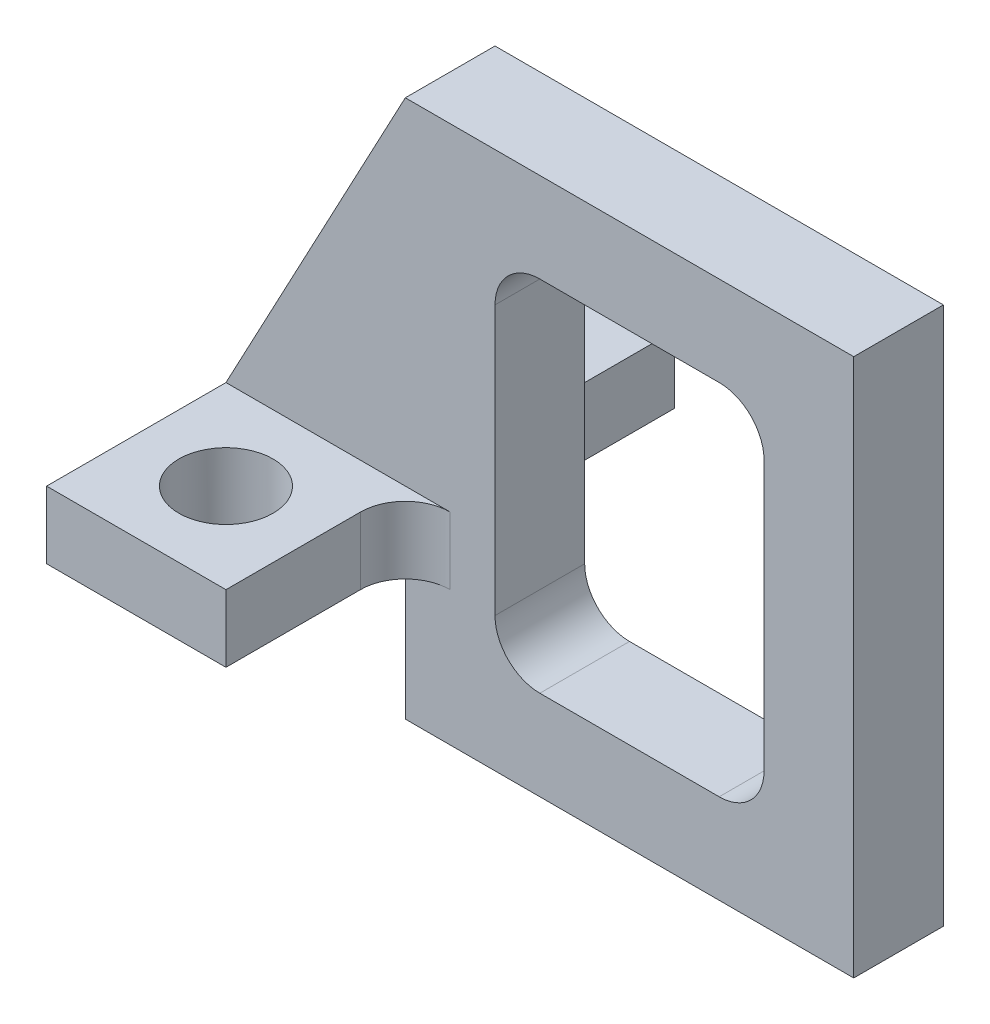
ISO-10303-21;
HEADER;
FILE_DESCRIPTION(('STEP AP214'),'2;1');
FILE_NAME('part.step','',(''),(''),'','','');
FILE_SCHEMA(('AUTOMOTIVE_DESIGN { 1 0 10303 214 1 1 1 1 }'));
ENDSEC;
DATA;
#1=APPLICATION_CONTEXT('core data for automotive mechanical design processes');
#2=APPLICATION_PROTOCOL_DEFINITION('international standard','automotive_design',2000,#1);
#3=PRODUCT_CONTEXT('',#1,'mechanical');
#4=PRODUCT('Part','Part','',(#3));
#5=PRODUCT_RELATED_PRODUCT_CATEGORY('part','',(#4));
#6=PRODUCT_DEFINITION_FORMATION('','',#4);
#7=PRODUCT_DEFINITION_CONTEXT('part definition',#1,'design');
#8=PRODUCT_DEFINITION('design','',#6,#7);
#9=PRODUCT_DEFINITION_SHAPE('','',#8);
#10=(LENGTH_UNIT() NAMED_UNIT(*) SI_UNIT(.MILLI.,.METRE.));
#11=(NAMED_UNIT(*) PLANE_ANGLE_UNIT() SI_UNIT($,.RADIAN.));
#12=(NAMED_UNIT(*) SI_UNIT($,.STERADIAN.) SOLID_ANGLE_UNIT());
#13=UNCERTAINTY_MEASURE_WITH_UNIT(LENGTH_MEASURE(1.E-05),#10,'distance_accuracy_value','');
#14=(GEOMETRIC_REPRESENTATION_CONTEXT(3) GLOBAL_UNCERTAINTY_ASSIGNED_CONTEXT((#13)) GLOBAL_UNIT_ASSIGNED_CONTEXT((#10,
#11,#12)) REPRESENTATION_CONTEXT('',''));
#15=CARTESIAN_POINT('',(0.,0.,0.));
#16=DIRECTION('',(0.,0.,1.));
#17=DIRECTION('',(1.,0.,0.));
#18=AXIS2_PLACEMENT_3D('',#15,#16,#17);
#19=CARTESIAN_POINT('',(-12.,5.,-8.));
#20=DIRECTION('',(0.,-1.,0.));
#21=DIRECTION('',(0.,0.,-1.));
#22=AXIS2_PLACEMENT_3D('',#19,#20,#21);
#23=PLANE('',#22);
#24=CARTESIAN_POINT('',(-8.,5.,-4.));
#25=DIRECTION('',(0.,1.,0.));
#26=DIRECTION('',(0.,0.,1.));
#27=AXIS2_PLACEMENT_3D('',#24,#25,#26);
#28=CIRCLE('',#27,2.1);
#29=CARTESIAN_POINT('',(-8.,5.,-1.9));
#30=VERTEX_POINT('',#29);
#31=EDGE_CURVE('E234',#30,#30,#28,.T.);
#32=ORIENTED_EDGE('',*,*,#31,.F.);
#33=EDGE_LOOP('',(#32));
#34=FACE_BOUND('',#33,.T.);
#35=DIRECTION('',(1.,0.,0.));
#36=VECTOR('',#35,1.);
#37=CARTESIAN_POINT('',(-4.,5.,0.));
#38=LINE('',#37,#36);
#39=CARTESIAN_POINT('',(-12.,5.,0.));
#40=VERTEX_POINT('',#39);
#41=CARTESIAN_POINT('',(-2.,5.,0.));
#42=VERTEX_POINT('',#41);
#43=EDGE_CURVE('E206',#40,#42,#38,.T.);
#44=ORIENTED_EDGE('',*,*,#43,.T.);
#45=CARTESIAN_POINT('',(-2.,5.,-2.));
#46=DIRECTION('',(0.,-1.,0.));
#47=DIRECTION('',(0.,0.,-1.));
#48=AXIS2_PLACEMENT_3D('',#45,#46,#47);
#49=CIRCLE('',#48,2.);
#50=CARTESIAN_POINT('',(-4.,5.,-2.));
#51=VERTEX_POINT('',#50);
#52=EDGE_CURVE('E11',#42,#51,#49,.T.);
#53=ORIENTED_EDGE('',*,*,#52,.T.);
#54=DIRECTION('',(0.,0.,-1.));
#55=VECTOR('',#54,1.);
#56=CARTESIAN_POINT('',(-4.,5.,-8.));
#57=LINE('',#56,#55);
#58=CARTESIAN_POINT('',(-4.,5.,-8.));
#59=VERTEX_POINT('',#58);
#60=EDGE_CURVE('E328',#51,#59,#57,.T.);
#61=ORIENTED_EDGE('',*,*,#60,.T.);
#62=DIRECTION('',(1.,0.,0.));
#63=VECTOR('',#62,1.);
#64=CARTESIAN_POINT('',(-12.,5.,-8.));
#65=LINE('',#64,#63);
#66=CARTESIAN_POINT('',(-12.,5.,-8.));
#67=VERTEX_POINT('',#66);
#68=EDGE_CURVE('E339',#67,#59,#65,.T.);
#69=ORIENTED_EDGE('',*,*,#68,.F.);
#70=DIRECTION('',(0.,0.,-1.));
#71=VECTOR('',#70,1.);
#72=CARTESIAN_POINT('',(-12.,5.,-8.));
#73=LINE('',#72,#71);
#74=EDGE_CURVE('E317',#40,#67,#73,.T.);
#75=ORIENTED_EDGE('',*,*,#74,.F.);
#76=EDGE_LOOP('',(#44,#53,#61,#69,#75));
#77=FACE_BOUND('',#76,.T.);
#78=ADVANCED_FACE('F41',(#34,#77),#23,.F.);
#79=CARTESIAN_POINT('',(-4.,-4.,4.));
#80=DIRECTION('',(1.,0.,0.));
#81=DIRECTION('',(0.,0.,-1.));
#82=AXIS2_PLACEMENT_3D('',#79,#80,#81);
#83=PLANE('',#82);
#84=DIRECTION('',(0.,0.,1.));
#85=VECTOR('',#84,1.);
#86=CARTESIAN_POINT('',(-4.,2.,-8.));
#87=LINE('',#86,#85);
#88=CARTESIAN_POINT('',(-4.,2.,0.));
#89=VERTEX_POINT('',#88);
#90=CARTESIAN_POINT('',(-4.,2.,4.));
#91=VERTEX_POINT('',#90);
#92=EDGE_CURVE('E229',#89,#91,#87,.T.);
#93=ORIENTED_EDGE('',*,*,#92,.F.);
#94=DIRECTION('',(0.,-1.,0.));
#95=VECTOR('',#94,1.);
#96=CARTESIAN_POINT('',(-4.,-4.,0.));
#97=LINE('',#96,#95);
#98=CARTESIAN_POINT('',(-4.,-4.,0.));
#99=VERTEX_POINT('',#98);
#100=EDGE_CURVE('E213',#89,#99,#97,.T.);
#101=ORIENTED_EDGE('',*,*,#100,.T.);
#102=DIRECTION('',(0.,0.,-1.));
#103=VECTOR('',#102,1.);
#104=CARTESIAN_POINT('',(-4.,-4.,4.));
#105=LINE('',#104,#103);
#106=CARTESIAN_POINT('',(-4.,-4.,4.));
#107=VERTEX_POINT('',#106);
#108=EDGE_CURVE('E198',#107,#99,#105,.T.);
#109=ORIENTED_EDGE('',*,*,#108,.F.);
#110=DIRECTION('',(0.,-1.,0.));
#111=VECTOR('',#110,1.);
#112=CARTESIAN_POINT('',(-4.,-4.,4.));
#113=LINE('',#112,#111);
#114=EDGE_CURVE('E223',#91,#107,#113,.T.);
#115=ORIENTED_EDGE('',*,*,#114,.F.);
#116=EDGE_LOOP('',(#93,#101,#109,#115));
#117=FACE_BOUND('',#116,.T.);
#118=ADVANCED_FACE('F385',(#117),#83,.F.);
#119=CARTESIAN_POINT('',(0.,0.,4.));
#120=DIRECTION('',(0.,0.,1.));
#121=DIRECTION('',(1.,0.,0.));
#122=AXIS2_PLACEMENT_3D('',#119,#120,#121);
#123=PLANE('',#122);
#124=DIRECTION('',(0.,-1.,0.));
#125=VECTOR('',#124,1.);
#126=CARTESIAN_POINT('',(-2.,2.,4.));
#127=LINE('',#126,#125);
#128=CARTESIAN_POINT('',(-2.,5.,4.));
#129=VERTEX_POINT('',#128);
#130=CARTESIAN_POINT('',(-2.,2.,4.));
#131=VERTEX_POINT('',#130);
#132=EDGE_CURVE('E274',#129,#131,#127,.T.);
#133=ORIENTED_EDGE('',*,*,#132,.T.);
#134=DIRECTION('',(-1.,0.,0.));
#135=VECTOR('',#134,1.);
#136=CARTESIAN_POINT('',(0.,2.,4.));
#137=LINE('',#136,#135);
#138=EDGE_CURVE('E277',#131,#91,#137,.T.);
#139=ORIENTED_EDGE('',*,*,#138,.T.);
#140=ORIENTED_EDGE('',*,*,#114,.T.);
#141=DIRECTION('',(1.,0.,0.));
#142=VECTOR('',#141,1.);
#143=CARTESIAN_POINT('',(-4.,-4.,4.));
#144=LINE('',#143,#142);
#145=CARTESIAN_POINT('',(16.,-4.,4.));
#146=VERTEX_POINT('',#145);
#147=EDGE_CURVE('E216',#107,#146,#144,.T.);
#148=ORIENTED_EDGE('',*,*,#147,.T.);
#149=DIRECTION('',(0.,1.,0.));
#150=VECTOR('',#149,1.);
#151=CARTESIAN_POINT('',(16.,-4.,4.));
#152=LINE('',#151,#150);
#153=CARTESIAN_POINT('',(16.,20.,4.));
#154=VERTEX_POINT('',#153);
#155=EDGE_CURVE('E370',#146,#154,#152,.T.);
#156=ORIENTED_EDGE('',*,*,#155,.T.);
#157=DIRECTION('',(-1.,0.,0.));
#158=VECTOR('',#157,1.);
#159=CARTESIAN_POINT('',(-4.,20.,4.));
#160=LINE('',#159,#158);
#161=CARTESIAN_POINT('',(-4.,20.,4.));
#162=VERTEX_POINT('',#161);
#163=EDGE_CURVE('E372',#154,#162,#160,.T.);
#164=ORIENTED_EDGE('',*,*,#163,.T.);
#165=DIRECTION('',(-0.470588235294118,-0.882352941176471,0.));
#166=VECTOR('',#165,1.);
#167=CARTESIAN_POINT('',(-12.,5.,4.));
#168=LINE('',#167,#166);
#169=CARTESIAN_POINT('',(-12.,5.,4.));
#170=VERTEX_POINT('',#169);
#171=EDGE_CURVE('E192',#162,#170,#168,.T.);
#172=ORIENTED_EDGE('',*,*,#171,.T.);
#173=DIRECTION('',(1.,0.,0.));
#174=VECTOR('',#173,1.);
#175=CARTESIAN_POINT('',(-4.,5.,4.));
#176=LINE('',#175,#174);
#177=EDGE_CURVE('E237',#170,#129,#176,.T.);
#178=ORIENTED_EDGE('',*,*,#177,.T.);
#179=EDGE_LOOP('',(#133,#139,#140,#148,#156,#164,#172,#178));
#180=FACE_BOUND('',#179,.T.);
#181=DIRECTION('',(1.,0.,0.));
#182=VECTOR('',#181,1.);
#183=CARTESIAN_POINT('',(0.,0.,4.));
#184=LINE('',#183,#182);
#185=CARTESIAN_POINT('',(2.,0.,4.));
#186=VERTEX_POINT('',#185);
#187=CARTESIAN_POINT('',(10.,0.,4.));
#188=VERTEX_POINT('',#187);
#189=EDGE_CURVE('E348',#186,#188,#184,.T.);
#190=ORIENTED_EDGE('',*,*,#189,.F.);
#191=CARTESIAN_POINT('',(2.,2.,4.));
#192=DIRECTION('',(0.,0.,1.));
#193=DIRECTION('',(1.,0.,0.));
#194=AXIS2_PLACEMENT_3D('',#191,#192,#193);
#195=CIRCLE('',#194,2.);
#196=CARTESIAN_POINT('',(0.,2.,4.));
#197=VERTEX_POINT('',#196);
#198=EDGE_CURVE('E272',#186,#197,#195,.F.);
#199=ORIENTED_EDGE('',*,*,#198,.T.);
#200=DIRECTION('',(0.,-1.,0.));
#201=VECTOR('',#200,1.);
#202=CARTESIAN_POINT('',(0.,0.,4.));
#203=LINE('',#202,#201);
#204=CARTESIAN_POINT('',(0.,14.,4.));
#205=VERTEX_POINT('',#204);
#206=EDGE_CURVE('E345',#205,#197,#203,.T.);
#207=ORIENTED_EDGE('',*,*,#206,.F.);
#208=CARTESIAN_POINT('',(2.,14.,4.));
#209=DIRECTION('',(0.,0.,1.));
#210=DIRECTION('',(1.,0.,0.));
#211=AXIS2_PLACEMENT_3D('',#208,#209,#210);
#212=CIRCLE('',#211,2.);
#213=CARTESIAN_POINT('',(2.,16.,4.));
#214=VERTEX_POINT('',#213);
#215=EDGE_CURVE('E260',#205,#214,#212,.F.);
#216=ORIENTED_EDGE('',*,*,#215,.T.);
#217=DIRECTION('',(-1.,0.,0.));
#218=VECTOR('',#217,1.);
#219=CARTESIAN_POINT('',(0.,16.,4.));
#220=LINE('',#219,#218);
#221=CARTESIAN_POINT('',(10.,16.,4.));
#222=VERTEX_POINT('',#221);
#223=EDGE_CURVE('E355',#222,#214,#220,.T.);
#224=ORIENTED_EDGE('',*,*,#223,.F.);
#225=CARTESIAN_POINT('',(10.,14.,4.));
#226=DIRECTION('',(0.,0.,1.));
#227=DIRECTION('',(1.,0.,0.));
#228=AXIS2_PLACEMENT_3D('',#225,#226,#227);
#229=CIRCLE('',#228,2.);
#230=CARTESIAN_POINT('',(12.,14.,4.));
#231=VERTEX_POINT('',#230);
#232=EDGE_CURVE('E264',#222,#231,#229,.F.);
#233=ORIENTED_EDGE('',*,*,#232,.T.);
#234=DIRECTION('',(0.,1.,0.));
#235=VECTOR('',#234,1.);
#236=CARTESIAN_POINT('',(12.,0.,4.));
#237=LINE('',#236,#235);
#238=CARTESIAN_POINT('',(12.,2.,4.));
#239=VERTEX_POINT('',#238);
#240=EDGE_CURVE('E352',#239,#231,#237,.T.);
#241=ORIENTED_EDGE('',*,*,#240,.F.);
#242=CARTESIAN_POINT('',(10.,2.,4.));
#243=DIRECTION('',(0.,0.,1.));
#244=DIRECTION('',(1.,0.,0.));
#245=AXIS2_PLACEMENT_3D('',#242,#243,#244);
#246=CIRCLE('',#245,2.);
#247=EDGE_CURVE('E268',#239,#188,#246,.F.);
#248=ORIENTED_EDGE('',*,*,#247,.T.);
#249=EDGE_LOOP('',(#190,#199,#207,#216,#224,#233,#241,#248));
#250=FACE_BOUND('',#249,.T.);
#251=ADVANCED_FACE('F305',(#180,#250),#123,.T.);
#252=CARTESIAN_POINT('',(0.,0.,0.));
#253=DIRECTION('',(0.,0.,1.));
#254=DIRECTION('',(1.,0.,0.));
#255=AXIS2_PLACEMENT_3D('',#252,#253,#254);
#256=PLANE('',#255);
#257=ORIENTED_EDGE('',*,*,#100,.F.);
#258=DIRECTION('',(1.,0.,0.));
#259=VECTOR('',#258,1.);
#260=CARTESIAN_POINT('',(-12.,2.,0.));
#261=LINE('',#260,#259);
#262=CARTESIAN_POINT('',(-2.,2.,0.));
#263=VERTEX_POINT('',#262);
#264=EDGE_CURVE('E56',#89,#263,#261,.T.);
#265=ORIENTED_EDGE('',*,*,#264,.T.);
#266=DIRECTION('',(0.,-1.,0.));
#267=VECTOR('',#266,1.);
#268=CARTESIAN_POINT('',(-2.,0.,0.));
#269=LINE('',#268,#267);
#270=EDGE_CURVE('E284',#263,#42,#269,.F.);
#271=ORIENTED_EDGE('',*,*,#270,.T.);
#272=ORIENTED_EDGE('',*,*,#43,.F.);
#273=DIRECTION('',(-0.470588235294118,-0.882352941176471,0.));
#274=VECTOR('',#273,1.);
#275=CARTESIAN_POINT('',(-12.,5.,0.));
#276=LINE('',#275,#274);
#277=CARTESIAN_POINT('',(-4.,20.,0.));
#278=VERTEX_POINT('',#277);
#279=EDGE_CURVE('E189',#278,#40,#276,.T.);
#280=ORIENTED_EDGE('',*,*,#279,.F.);
#281=DIRECTION('',(-1.,0.,0.));
#282=VECTOR('',#281,1.);
#283=CARTESIAN_POINT('',(-4.,20.,0.));
#284=LINE('',#283,#282);
#285=CARTESIAN_POINT('',(16.,20.,0.));
#286=VERTEX_POINT('',#285);
#287=EDGE_CURVE('E204',#286,#278,#284,.T.);
#288=ORIENTED_EDGE('',*,*,#287,.F.);
#289=DIRECTION('',(0.,1.,0.));
#290=VECTOR('',#289,1.);
#291=CARTESIAN_POINT('',(16.,-4.,0.));
#292=LINE('',#291,#290);
#293=CARTESIAN_POINT('',(16.,-4.,0.));
#294=VERTEX_POINT('',#293);
#295=EDGE_CURVE('E214',#294,#286,#292,.T.);
#296=ORIENTED_EDGE('',*,*,#295,.F.);
#297=DIRECTION('',(1.,0.,0.));
#298=VECTOR('',#297,1.);
#299=CARTESIAN_POINT('',(-4.,-4.,0.));
#300=LINE('',#299,#298);
#301=EDGE_CURVE('E218',#99,#294,#300,.T.);
#302=ORIENTED_EDGE('',*,*,#301,.F.);
#303=EDGE_LOOP('',(#257,#265,#271,#272,#280,#288,#296,#302));
#304=FACE_BOUND('',#303,.T.);
#305=DIRECTION('',(-1.,0.,0.));
#306=VECTOR('',#305,1.);
#307=CARTESIAN_POINT('',(0.,16.,0.));
#308=LINE('',#307,#306);
#309=CARTESIAN_POINT('',(10.,16.,0.));
#310=VERTEX_POINT('',#309);
#311=CARTESIAN_POINT('',(2.,16.,0.));
#312=VERTEX_POINT('',#311);
#313=EDGE_CURVE('E349',#310,#312,#308,.T.);
#314=ORIENTED_EDGE('',*,*,#313,.T.);
#315=CARTESIAN_POINT('',(2.,14.,0.));
#316=DIRECTION('',(0.,0.,1.));
#317=DIRECTION('',(1.,0.,0.));
#318=AXIS2_PLACEMENT_3D('',#315,#316,#317);
#319=CIRCLE('',#318,2.);
#320=CARTESIAN_POINT('',(0.,14.,0.));
#321=VERTEX_POINT('',#320);
#322=EDGE_CURVE('E258',#312,#321,#319,.T.);
#323=ORIENTED_EDGE('',*,*,#322,.T.);
#324=DIRECTION('',(0.,-1.,0.));
#325=VECTOR('',#324,1.);
#326=CARTESIAN_POINT('',(0.,0.,0.));
#327=LINE('',#326,#325);
#328=CARTESIAN_POINT('',(0.,2.,0.));
#329=VERTEX_POINT('',#328);
#330=EDGE_CURVE('E344',#321,#329,#327,.T.);
#331=ORIENTED_EDGE('',*,*,#330,.T.);
#332=CARTESIAN_POINT('',(2.,2.,0.));
#333=DIRECTION('',(0.,0.,1.));
#334=DIRECTION('',(1.,0.,0.));
#335=AXIS2_PLACEMENT_3D('',#332,#333,#334);
#336=CIRCLE('',#335,2.);
#337=CARTESIAN_POINT('',(2.,0.,0.));
#338=VERTEX_POINT('',#337);
#339=EDGE_CURVE('E270',#329,#338,#336,.T.);
#340=ORIENTED_EDGE('',*,*,#339,.T.);
#341=DIRECTION('',(1.,0.,0.));
#342=VECTOR('',#341,1.);
#343=CARTESIAN_POINT('',(0.,0.,0.));
#344=LINE('',#343,#342);
#345=CARTESIAN_POINT('',(10.,0.,0.));
#346=VERTEX_POINT('',#345);
#347=EDGE_CURVE('E360',#338,#346,#344,.T.);
#348=ORIENTED_EDGE('',*,*,#347,.T.);
#349=CARTESIAN_POINT('',(10.,2.,0.));
#350=DIRECTION('',(0.,0.,1.));
#351=DIRECTION('',(1.,0.,0.));
#352=AXIS2_PLACEMENT_3D('',#349,#350,#351);
#353=CIRCLE('',#352,2.);
#354=CARTESIAN_POINT('',(12.,2.,0.));
#355=VERTEX_POINT('',#354);
#356=EDGE_CURVE('E266',#346,#355,#353,.T.);
#357=ORIENTED_EDGE('',*,*,#356,.T.);
#358=DIRECTION('',(0.,1.,0.));
#359=VECTOR('',#358,1.);
#360=CARTESIAN_POINT('',(12.,0.,0.));
#361=LINE('',#360,#359);
#362=CARTESIAN_POINT('',(12.,14.,0.));
#363=VERTEX_POINT('',#362);
#364=EDGE_CURVE('E363',#355,#363,#361,.T.);
#365=ORIENTED_EDGE('',*,*,#364,.T.);
#366=CARTESIAN_POINT('',(10.,14.,0.));
#367=DIRECTION('',(0.,0.,1.));
#368=DIRECTION('',(1.,0.,0.));
#369=AXIS2_PLACEMENT_3D('',#366,#367,#368);
#370=CIRCLE('',#369,2.);
#371=EDGE_CURVE('E262',#363,#310,#370,.T.);
#372=ORIENTED_EDGE('',*,*,#371,.T.);
#373=EDGE_LOOP('',(#314,#323,#331,#340,#348,#357,#365,#372));
#374=FACE_BOUND('',#373,.T.);
#375=ADVANCED_FACE('F202',(#304,#374),#256,.F.);
#376=CARTESIAN_POINT('',(-4.,-4.,4.));
#377=DIRECTION('',(0.,1.,0.));
#378=DIRECTION('',(0.,0.,1.));
#379=AXIS2_PLACEMENT_3D('',#376,#377,#378);
#380=PLANE('',#379);
#381=ORIENTED_EDGE('',*,*,#301,.T.);
#382=DIRECTION('',(0.,0.,-1.));
#383=VECTOR('',#382,1.);
#384=CARTESIAN_POINT('',(16.,-4.,4.));
#385=LINE('',#384,#383);
#386=EDGE_CURVE('E226',#146,#294,#385,.T.);
#387=ORIENTED_EDGE('',*,*,#386,.F.);
#388=ORIENTED_EDGE('',*,*,#147,.F.);
#389=ORIENTED_EDGE('',*,*,#108,.T.);
#390=EDGE_LOOP('',(#381,#387,#388,#389));
#391=FACE_BOUND('',#390,.T.);
#392=ADVANCED_FACE('F378',(#391),#380,.F.);
#393=CARTESIAN_POINT('',(16.,-4.,4.));
#394=DIRECTION('',(-1.,0.,0.));
#395=DIRECTION('',(0.,0.,1.));
#396=AXIS2_PLACEMENT_3D('',#393,#394,#395);
#397=PLANE('',#396);
#398=ORIENTED_EDGE('',*,*,#295,.T.);
#399=DIRECTION('',(0.,0.,-1.));
#400=VECTOR('',#399,1.);
#401=CARTESIAN_POINT('',(16.,20.,4.));
#402=LINE('',#401,#400);
#403=EDGE_CURVE('E197',#154,#286,#402,.T.);
#404=ORIENTED_EDGE('',*,*,#403,.F.);
#405=ORIENTED_EDGE('',*,*,#155,.F.);
#406=ORIENTED_EDGE('',*,*,#386,.T.);
#407=EDGE_LOOP('',(#398,#404,#405,#406));
#408=FACE_BOUND('',#407,.T.);
#409=ADVANCED_FACE('F383',(#408),#397,.F.);
#410=CARTESIAN_POINT('',(-4.,20.,4.));
#411=DIRECTION('',(0.,-1.,0.));
#412=DIRECTION('',(0.,0.,-1.));
#413=AXIS2_PLACEMENT_3D('',#410,#411,#412);
#414=PLANE('',#413);
#415=ORIENTED_EDGE('',*,*,#287,.T.);
#416=DIRECTION('',(0.,0.,-1.));
#417=VECTOR('',#416,1.);
#418=CARTESIAN_POINT('',(-4.,20.,4.));
#419=LINE('',#418,#417);
#420=EDGE_CURVE('E186',#162,#278,#419,.T.);
#421=ORIENTED_EDGE('',*,*,#420,.F.);
#422=ORIENTED_EDGE('',*,*,#163,.F.);
#423=ORIENTED_EDGE('',*,*,#403,.T.);
#424=EDGE_LOOP('',(#415,#421,#422,#423));
#425=FACE_BOUND('',#424,.T.);
#426=ADVANCED_FACE('F211',(#425),#414,.F.);
#427=CARTESIAN_POINT('',(0.,0.,4.));
#428=DIRECTION('',(1.,0.,0.));
#429=DIRECTION('',(0.,0.,-1.));
#430=AXIS2_PLACEMENT_3D('',#427,#428,#429);
#431=PLANE('',#430);
#432=ORIENTED_EDGE('',*,*,#330,.F.);
#433=DIRECTION('',(0.,0.,-1.));
#434=VECTOR('',#433,1.);
#435=CARTESIAN_POINT('',(0.,14.,4.));
#436=LINE('',#435,#434);
#437=EDGE_CURVE('E246',#321,#205,#436,.F.);
#438=ORIENTED_EDGE('',*,*,#437,.T.);
#439=ORIENTED_EDGE('',*,*,#206,.T.);
#440=DIRECTION('',(0.,0.,-1.));
#441=VECTOR('',#440,1.);
#442=CARTESIAN_POINT('',(0.,2.,0.));
#443=LINE('',#442,#441);
#444=EDGE_CURVE('E243',#197,#329,#443,.T.);
#445=ORIENTED_EDGE('',*,*,#444,.T.);
#446=EDGE_LOOP('',(#432,#438,#439,#445));
#447=FACE_BOUND('',#446,.T.);
#448=ADVANCED_FACE('F592',(#447),#431,.T.);
#449=CARTESIAN_POINT('',(0.,0.,4.));
#450=DIRECTION('',(0.,1.,0.));
#451=DIRECTION('',(0.,0.,1.));
#452=AXIS2_PLACEMENT_3D('',#449,#450,#451);
#453=PLANE('',#452);
#454=ORIENTED_EDGE('',*,*,#189,.T.);
#455=DIRECTION('',(0.,0.,-1.));
#456=VECTOR('',#455,1.);
#457=CARTESIAN_POINT('',(10.,0.,0.));
#458=LINE('',#457,#456);
#459=EDGE_CURVE('E255',#188,#346,#458,.T.);
#460=ORIENTED_EDGE('',*,*,#459,.T.);
#461=ORIENTED_EDGE('',*,*,#347,.F.);
#462=DIRECTION('',(0.,0.,-1.));
#463=VECTOR('',#462,1.);
#464=CARTESIAN_POINT('',(2.,0.,4.));
#465=LINE('',#464,#463);
#466=EDGE_CURVE('E253',#338,#186,#465,.F.);
#467=ORIENTED_EDGE('',*,*,#466,.T.);
#468=EDGE_LOOP('',(#454,#460,#461,#467));
#469=FACE_BOUND('',#468,.T.);
#470=ADVANCED_FACE('F584',(#469),#453,.T.);
#471=CARTESIAN_POINT('',(12.,0.,4.));
#472=DIRECTION('',(-1.,0.,0.));
#473=DIRECTION('',(0.,0.,1.));
#474=AXIS2_PLACEMENT_3D('',#471,#472,#473);
#475=PLANE('',#474);
#476=ORIENTED_EDGE('',*,*,#240,.T.);
#477=DIRECTION('',(0.,0.,-1.));
#478=VECTOR('',#477,1.);
#479=CARTESIAN_POINT('',(12.,14.,0.));
#480=LINE('',#479,#478);
#481=EDGE_CURVE('E250',#231,#363,#480,.T.);
#482=ORIENTED_EDGE('',*,*,#481,.T.);
#483=ORIENTED_EDGE('',*,*,#364,.F.);
#484=DIRECTION('',(0.,0.,-1.));
#485=VECTOR('',#484,1.);
#486=CARTESIAN_POINT('',(12.,2.,4.));
#487=LINE('',#486,#485);
#488=EDGE_CURVE('E248',#355,#239,#487,.F.);
#489=ORIENTED_EDGE('',*,*,#488,.T.);
#490=EDGE_LOOP('',(#476,#482,#483,#489));
#491=FACE_BOUND('',#490,.T.);
#492=ADVANCED_FACE('F576',(#491),#475,.T.);
#493=CARTESIAN_POINT('',(0.,16.,4.));
#494=DIRECTION('',(0.,-1.,0.));
#495=DIRECTION('',(0.,0.,-1.));
#496=AXIS2_PLACEMENT_3D('',#493,#494,#495);
#497=PLANE('',#496);
#498=ORIENTED_EDGE('',*,*,#223,.T.);
#499=DIRECTION('',(0.,0.,-1.));
#500=VECTOR('',#499,1.);
#501=CARTESIAN_POINT('',(2.,16.,0.));
#502=LINE('',#501,#500);
#503=EDGE_CURVE('E240',#214,#312,#502,.T.);
#504=ORIENTED_EDGE('',*,*,#503,.T.);
#505=ORIENTED_EDGE('',*,*,#313,.F.);
#506=DIRECTION('',(0.,0.,-1.));
#507=VECTOR('',#506,1.);
#508=CARTESIAN_POINT('',(10.,16.,4.));
#509=LINE('',#508,#507);
#510=EDGE_CURVE('E238',#310,#222,#509,.F.);
#511=ORIENTED_EDGE('',*,*,#510,.T.);
#512=EDGE_LOOP('',(#498,#504,#505,#511));
#513=FACE_BOUND('',#512,.T.);
#514=ADVANCED_FACE('F566',(#513),#497,.T.);
#515=CARTESIAN_POINT('',(-4.,0.,0.));
#516=DIRECTION('',(1.,0.,0.));
#517=DIRECTION('',(0.,0.,-1.));
#518=AXIS2_PLACEMENT_3D('',#515,#516,#517);
#519=PLANE('',#518);
#520=CARTESIAN_POINT('',(-4.,2.,6.));
#521=VERTEX_POINT('',#520);
#522=CARTESIAN_POINT('',(-4.,2.,12.));
#523=VERTEX_POINT('',#522);
#524=EDGE_CURVE('E332',#521,#523,#87,.T.);
#525=ORIENTED_EDGE('',*,*,#524,.F.);
#526=DIRECTION('',(0.,-1.,0.));
#527=VECTOR('',#526,1.);
#528=CARTESIAN_POINT('',(-4.,5.,6.));
#529=LINE('',#528,#527);
#530=CARTESIAN_POINT('',(-4.,5.,6.));
#531=VERTEX_POINT('',#530);
#532=EDGE_CURVE('E279',#521,#531,#529,.F.);
#533=ORIENTED_EDGE('',*,*,#532,.T.);
#534=CARTESIAN_POINT('',(-4.,5.,12.));
#535=VERTEX_POINT('',#534);
#536=EDGE_CURVE('E299',#535,#531,#57,.T.);
#537=ORIENTED_EDGE('',*,*,#536,.F.);
#538=DIRECTION('',(0.,1.,0.));
#539=VECTOR('',#538,1.);
#540=CARTESIAN_POINT('',(-4.,2.,12.));
#541=LINE('',#540,#539);
#542=EDGE_CURVE('E313',#523,#535,#541,.T.);
#543=ORIENTED_EDGE('',*,*,#542,.F.);
#544=EDGE_LOOP('',(#525,#533,#537,#543));
#545=FACE_BOUND('',#544,.T.);
#546=ADVANCED_FACE('F396',(#545),#519,.T.);
#547=CARTESIAN_POINT('',(-12.,2.,12.));
#548=DIRECTION('',(0.,0.,-1.));
#549=DIRECTION('',(-1.,0.,0.));
#550=AXIS2_PLACEMENT_3D('',#547,#548,#549);
#551=PLANE('',#550);
#552=ORIENTED_EDGE('',*,*,#542,.T.);
#553=DIRECTION('',(1.,0.,0.));
#554=VECTOR('',#553,1.);
#555=CARTESIAN_POINT('',(-12.,5.,12.));
#556=LINE('',#555,#554);
#557=CARTESIAN_POINT('',(-12.,5.,12.));
#558=VERTEX_POINT('',#557);
#559=EDGE_CURVE('E342',#558,#535,#556,.T.);
#560=ORIENTED_EDGE('',*,*,#559,.F.);
#561=DIRECTION('',(0.,1.,0.));
#562=VECTOR('',#561,1.);
#563=CARTESIAN_POINT('',(-12.,2.,12.));
#564=LINE('',#563,#562);
#565=CARTESIAN_POINT('',(-12.,2.,12.));
#566=VERTEX_POINT('',#565);
#567=EDGE_CURVE('E314',#566,#558,#564,.T.);
#568=ORIENTED_EDGE('',*,*,#567,.F.);
#569=DIRECTION('',(1.,0.,0.));
#570=VECTOR('',#569,1.);
#571=CARTESIAN_POINT('',(-12.,2.,12.));
#572=LINE('',#571,#570);
#573=EDGE_CURVE('E325',#566,#523,#572,.T.);
#574=ORIENTED_EDGE('',*,*,#573,.T.);
#575=EDGE_LOOP('',(#552,#560,#568,#574));
#576=FACE_BOUND('',#575,.T.);
#577=ADVANCED_FACE('F394',(#576),#551,.F.);
#578=CARTESIAN_POINT('',(-8.,5.,8.));
#579=DIRECTION('',(0.,1.,0.));
#580=DIRECTION('',(0.,0.,-1.));
#581=AXIS2_PLACEMENT_3D('',#578,#579,#580);
#582=CIRCLE('',#581,2.1);
#583=CARTESIAN_POINT('',(-8.,5.,5.9));
#584=VERTEX_POINT('',#583);
#585=EDGE_CURVE('E415',#584,#584,#582,.T.);
#586=ORIENTED_EDGE('',*,*,#585,.F.);
#587=EDGE_LOOP('',(#586));
#588=FACE_BOUND('',#587,.T.);
#589=ORIENTED_EDGE('',*,*,#536,.T.);
#590=CARTESIAN_POINT('',(-2.,5.,6.));
#591=DIRECTION('',(0.,-1.,0.));
#592=DIRECTION('',(0.,0.,-1.));
#593=AXIS2_PLACEMENT_3D('',#590,#591,#592);
#594=CIRCLE('',#593,2.);
#595=EDGE_CURVE('E289',#531,#129,#594,.T.);
#596=ORIENTED_EDGE('',*,*,#595,.T.);
#597=ORIENTED_EDGE('',*,*,#177,.F.);
#598=EDGE_CURVE('E319',#558,#170,#73,.T.);
#599=ORIENTED_EDGE('',*,*,#598,.F.);
#600=ORIENTED_EDGE('',*,*,#559,.T.);
#601=EDGE_LOOP('',(#589,#596,#597,#599,#600));
#602=FACE_BOUND('',#601,.T.);
#603=ADVANCED_FACE('F296',(#588,#602),#23,.F.);
#604=CARTESIAN_POINT('',(-12.,2.,-8.));
#605=DIRECTION('',(0.,0.,1.));
#606=DIRECTION('',(1.,0.,0.));
#607=AXIS2_PLACEMENT_3D('',#604,#605,#606);
#608=PLANE('',#607);
#609=DIRECTION('',(0.,-1.,0.));
#610=VECTOR('',#609,1.);
#611=CARTESIAN_POINT('',(-4.,2.,-8.));
#612=LINE('',#611,#610);
#613=CARTESIAN_POINT('',(-4.,2.,-8.));
#614=VERTEX_POINT('',#613);
#615=EDGE_CURVE('E330',#59,#614,#612,.T.);
#616=ORIENTED_EDGE('',*,*,#615,.T.);
#617=DIRECTION('',(1.,0.,0.));
#618=VECTOR('',#617,1.);
#619=CARTESIAN_POINT('',(-12.,2.,-8.));
#620=LINE('',#619,#618);
#621=CARTESIAN_POINT('',(-12.,2.,-8.));
#622=VERTEX_POINT('',#621);
#623=EDGE_CURVE('E336',#622,#614,#620,.T.);
#624=ORIENTED_EDGE('',*,*,#623,.F.);
#625=DIRECTION('',(0.,-1.,0.));
#626=VECTOR('',#625,1.);
#627=CARTESIAN_POINT('',(-12.,2.,-8.));
#628=LINE('',#627,#626);
#629=EDGE_CURVE('E321',#67,#622,#628,.T.);
#630=ORIENTED_EDGE('',*,*,#629,.F.);
#631=ORIENTED_EDGE('',*,*,#68,.T.);
#632=EDGE_LOOP('',(#616,#624,#630,#631));
#633=FACE_BOUND('',#632,.T.);
#634=ADVANCED_FACE('F435',(#633),#608,.F.);
#635=CARTESIAN_POINT('',(-12.,2.,-8.));
#636=DIRECTION('',(0.,1.,0.));
#637=DIRECTION('',(0.,0.,1.));
#638=AXIS2_PLACEMENT_3D('',#635,#636,#637);
#639=PLANE('',#638);
#640=CARTESIAN_POINT('',(-8.,2.,-4.));
#641=DIRECTION('',(0.,1.,0.));
#642=DIRECTION('',(0.,0.,1.));
#643=AXIS2_PLACEMENT_3D('',#640,#641,#642);
#644=CIRCLE('',#643,2.1);
#645=CARTESIAN_POINT('',(-8.,2.,-1.9));
#646=VERTEX_POINT('',#645);
#647=EDGE_CURVE('E233',#646,#646,#644,.T.);
#648=ORIENTED_EDGE('',*,*,#647,.T.);
#649=EDGE_LOOP('',(#648));
#650=FACE_BOUND('',#649,.T.);
#651=CARTESIAN_POINT('',(-8.,2.,8.));
#652=DIRECTION('',(0.,1.,0.));
#653=DIRECTION('',(0.,0.,1.));
#654=AXIS2_PLACEMENT_3D('',#651,#652,#653);
#655=CIRCLE('',#654,2.1);
#656=CARTESIAN_POINT('',(-8.,2.,10.1));
#657=VERTEX_POINT('',#656);
#658=EDGE_CURVE('E230',#657,#657,#655,.T.);
#659=ORIENTED_EDGE('',*,*,#658,.T.);
#660=EDGE_LOOP('',(#659));
#661=FACE_BOUND('',#660,.T.);
#662=CARTESIAN_POINT('',(-4.,2.,-2.));
#663=VERTEX_POINT('',#662);
#664=EDGE_CURVE('E318',#614,#663,#87,.T.);
#665=ORIENTED_EDGE('',*,*,#664,.T.);
#666=CARTESIAN_POINT('',(-2.,2.,-2.));
#667=DIRECTION('',(0.,1.,0.));
#668=DIRECTION('',(0.,0.,1.));
#669=AXIS2_PLACEMENT_3D('',#666,#667,#668);
#670=CIRCLE('',#669,2.);
#671=EDGE_CURVE('E49',#663,#263,#670,.T.);
#672=ORIENTED_EDGE('',*,*,#671,.T.);
#673=ORIENTED_EDGE('',*,*,#264,.F.);
#674=ORIENTED_EDGE('',*,*,#92,.T.);
#675=ORIENTED_EDGE('',*,*,#138,.F.);
#676=CARTESIAN_POINT('',(-2.,2.,6.));
#677=DIRECTION('',(0.,1.,0.));
#678=DIRECTION('',(0.,0.,1.));
#679=AXIS2_PLACEMENT_3D('',#676,#677,#678);
#680=CIRCLE('',#679,2.);
#681=EDGE_CURVE('E287',#131,#521,#680,.T.);
#682=ORIENTED_EDGE('',*,*,#681,.T.);
#683=ORIENTED_EDGE('',*,*,#524,.T.);
#684=ORIENTED_EDGE('',*,*,#573,.F.);
#685=DIRECTION('',(0.,0.,1.));
#686=VECTOR('',#685,1.);
#687=CARTESIAN_POINT('',(-12.,2.,-8.));
#688=LINE('',#687,#686);
#689=EDGE_CURVE('E323',#622,#566,#688,.T.);
#690=ORIENTED_EDGE('',*,*,#689,.F.);
#691=ORIENTED_EDGE('',*,*,#623,.T.);
#692=EDGE_LOOP('',(#665,#672,#673,#674,#675,#682,#683,#684,#690,#691));
#693=FACE_BOUND('',#692,.T.);
#694=ADVANCED_FACE('F388',(#650,#661,#693),#639,.F.);
#695=CARTESIAN_POINT('',(-12.,0.,0.));
#696=DIRECTION('',(1.,0.,0.));
#697=DIRECTION('',(0.,0.,-1.));
#698=AXIS2_PLACEMENT_3D('',#695,#696,#697);
#699=PLANE('',#698);
#700=ORIENTED_EDGE('',*,*,#567,.T.);
#701=ORIENTED_EDGE('',*,*,#598,.T.);
#702=DIRECTION('',(0.,0.,1.));
#703=VECTOR('',#702,1.);
#704=CARTESIAN_POINT('',(-12.,5.,0.));
#705=LINE('',#704,#703);
#706=EDGE_CURVE('E208',#40,#170,#705,.T.);
#707=ORIENTED_EDGE('',*,*,#706,.F.);
#708=ORIENTED_EDGE('',*,*,#74,.T.);
#709=ORIENTED_EDGE('',*,*,#629,.T.);
#710=ORIENTED_EDGE('',*,*,#689,.T.);
#711=EDGE_LOOP('',(#700,#701,#707,#708,#709,#710));
#712=FACE_BOUND('',#711,.T.);
#713=ADVANCED_FACE('F399',(#712),#699,.F.);
#714=ORIENTED_EDGE('',*,*,#60,.F.);
#715=DIRECTION('',(0.,-1.,0.));
#716=VECTOR('',#715,1.);
#717=CARTESIAN_POINT('',(-4.,0.,-2.));
#718=LINE('',#717,#716);
#719=EDGE_CURVE('E281',#51,#663,#718,.T.);
#720=ORIENTED_EDGE('',*,*,#719,.T.);
#721=ORIENTED_EDGE('',*,*,#664,.F.);
#722=ORIENTED_EDGE('',*,*,#615,.F.);
#723=EDGE_LOOP('',(#714,#720,#721,#722));
#724=FACE_BOUND('',#723,.T.);
#725=ADVANCED_FACE('F407',(#724),#519,.T.);
#726=CARTESIAN_POINT('',(-12.,5.,0.));
#727=DIRECTION('',(-0.882352941176471,0.470588235294118,0.));
#728=DIRECTION('',(-0.470588235294118,-0.882352941176471,0.));
#729=AXIS2_PLACEMENT_3D('',#726,#727,#728);
#730=PLANE('',#729);
#731=ORIENTED_EDGE('',*,*,#171,.F.);
#732=ORIENTED_EDGE('',*,*,#420,.T.);
#733=ORIENTED_EDGE('',*,*,#279,.T.);
#734=ORIENTED_EDGE('',*,*,#706,.T.);
#735=EDGE_LOOP('',(#731,#732,#733,#734));
#736=FACE_BOUND('',#735,.T.);
#737=ADVANCED_FACE('F188',(#736),#730,.T.);
#738=CARTESIAN_POINT('',(-8.,-4.,8.));
#739=DIRECTION('',(0.,1.,0.));
#740=DIRECTION('',(0.,0.,1.));
#741=AXIS2_PLACEMENT_3D('',#738,#739,#740);
#742=CYLINDRICAL_SURFACE('',#741,2.1);
#743=ORIENTED_EDGE('',*,*,#585,.T.);
#744=EDGE_LOOP('',(#743));
#745=FACE_BOUND('',#744,.T.);
#746=ORIENTED_EDGE('',*,*,#658,.F.);
#747=EDGE_LOOP('',(#746));
#748=FACE_BOUND('',#747,.T.);
#749=ADVANCED_FACE('F445',(#745,#748),#742,.F.);
#750=CARTESIAN_POINT('',(-8.,-4.,-4.));
#751=DIRECTION('',(0.,1.,0.));
#752=DIRECTION('',(0.,0.,1.));
#753=AXIS2_PLACEMENT_3D('',#750,#751,#752);
#754=CYLINDRICAL_SURFACE('',#753,2.1);
#755=ORIENTED_EDGE('',*,*,#31,.T.);
#756=EDGE_LOOP('',(#755));
#757=FACE_BOUND('',#756,.T.);
#758=ORIENTED_EDGE('',*,*,#647,.F.);
#759=EDGE_LOOP('',(#758));
#760=FACE_BOUND('',#759,.T.);
#761=ADVANCED_FACE('F421',(#757,#760),#754,.F.);
#762=CARTESIAN_POINT('',(2.,14.,4.));
#763=DIRECTION('',(0.,0.,1.));
#764=DIRECTION('',(1.,0.,0.));
#765=AXIS2_PLACEMENT_3D('',#762,#763,#764);
#766=CYLINDRICAL_SURFACE('',#765,2.);
#767=ORIENTED_EDGE('',*,*,#215,.F.);
#768=ORIENTED_EDGE('',*,*,#437,.F.);
#769=ORIENTED_EDGE('',*,*,#322,.F.);
#770=ORIENTED_EDGE('',*,*,#503,.F.);
#771=EDGE_LOOP('',(#767,#768,#769,#770));
#772=FACE_BOUND('',#771,.T.);
#773=ADVANCED_FACE('F463',(#772),#766,.F.);
#774=CARTESIAN_POINT('',(10.,14.,4.));
#775=DIRECTION('',(0.,0.,1.));
#776=DIRECTION('',(1.,0.,0.));
#777=AXIS2_PLACEMENT_3D('',#774,#775,#776);
#778=CYLINDRICAL_SURFACE('',#777,2.);
#779=ORIENTED_EDGE('',*,*,#232,.F.);
#780=ORIENTED_EDGE('',*,*,#510,.F.);
#781=ORIENTED_EDGE('',*,*,#371,.F.);
#782=ORIENTED_EDGE('',*,*,#481,.F.);
#783=EDGE_LOOP('',(#779,#780,#781,#782));
#784=FACE_BOUND('',#783,.T.);
#785=ADVANCED_FACE('F468',(#784),#778,.F.);
#786=CARTESIAN_POINT('',(10.,2.,4.));
#787=DIRECTION('',(0.,0.,1.));
#788=DIRECTION('',(1.,0.,0.));
#789=AXIS2_PLACEMENT_3D('',#786,#787,#788);
#790=CYLINDRICAL_SURFACE('',#789,2.);
#791=ORIENTED_EDGE('',*,*,#247,.F.);
#792=ORIENTED_EDGE('',*,*,#488,.F.);
#793=ORIENTED_EDGE('',*,*,#356,.F.);
#794=ORIENTED_EDGE('',*,*,#459,.F.);
#795=EDGE_LOOP('',(#791,#792,#793,#794));
#796=FACE_BOUND('',#795,.T.);
#797=ADVANCED_FACE('F475',(#796),#790,.F.);
#798=CARTESIAN_POINT('',(2.,2.,4.));
#799=DIRECTION('',(0.,0.,1.));
#800=DIRECTION('',(1.,0.,0.));
#801=AXIS2_PLACEMENT_3D('',#798,#799,#800);
#802=CYLINDRICAL_SURFACE('',#801,2.);
#803=ORIENTED_EDGE('',*,*,#198,.F.);
#804=ORIENTED_EDGE('',*,*,#466,.F.);
#805=ORIENTED_EDGE('',*,*,#339,.F.);
#806=ORIENTED_EDGE('',*,*,#444,.F.);
#807=EDGE_LOOP('',(#803,#804,#805,#806));
#808=FACE_BOUND('',#807,.T.);
#809=ADVANCED_FACE('F484',(#808),#802,.F.);
#810=CARTESIAN_POINT('',(-2.,0.,6.));
#811=DIRECTION('',(0.,1.,0.));
#812=DIRECTION('',(0.,0.,1.));
#813=AXIS2_PLACEMENT_3D('',#810,#811,#812);
#814=CYLINDRICAL_SURFACE('',#813,2.);
#815=ORIENTED_EDGE('',*,*,#595,.F.);
#816=ORIENTED_EDGE('',*,*,#532,.F.);
#817=ORIENTED_EDGE('',*,*,#681,.F.);
#818=ORIENTED_EDGE('',*,*,#132,.F.);
#819=EDGE_LOOP('',(#815,#816,#817,#818));
#820=FACE_BOUND('',#819,.T.);
#821=ADVANCED_FACE('F302',(#820),#814,.F.);
#822=CARTESIAN_POINT('',(-2.,0.,-2.));
#823=DIRECTION('',(0.,-1.,0.));
#824=DIRECTION('',(0.,0.,-1.));
#825=AXIS2_PLACEMENT_3D('',#822,#823,#824);
#826=CYLINDRICAL_SURFACE('',#825,2.);
#827=ORIENTED_EDGE('',*,*,#52,.F.);
#828=ORIENTED_EDGE('',*,*,#270,.F.);
#829=ORIENTED_EDGE('',*,*,#671,.F.);
#830=ORIENTED_EDGE('',*,*,#719,.F.);
#831=EDGE_LOOP('',(#827,#828,#829,#830));
#832=FACE_BOUND('',#831,.T.);
#833=ADVANCED_FACE('F43',(#832),#826,.F.);
#834=CLOSED_SHELL('',(#78,#118,#251,#375,#392,#409,#426,#448,#470,#492,#514,#546,#577,#603,#634,
#694,#713,#725,#737,#749,#761,#773,#785,#797,#809,#821,#833));
#835=MANIFOLD_SOLID_BREP('B2',#834);
#836=ADVANCED_BREP_SHAPE_REPRESENTATION('',(#18,#835),#14);
#837=SHAPE_DEFINITION_REPRESENTATION(#9,#836);
ENDSEC;
END-ISO-10303-21;
